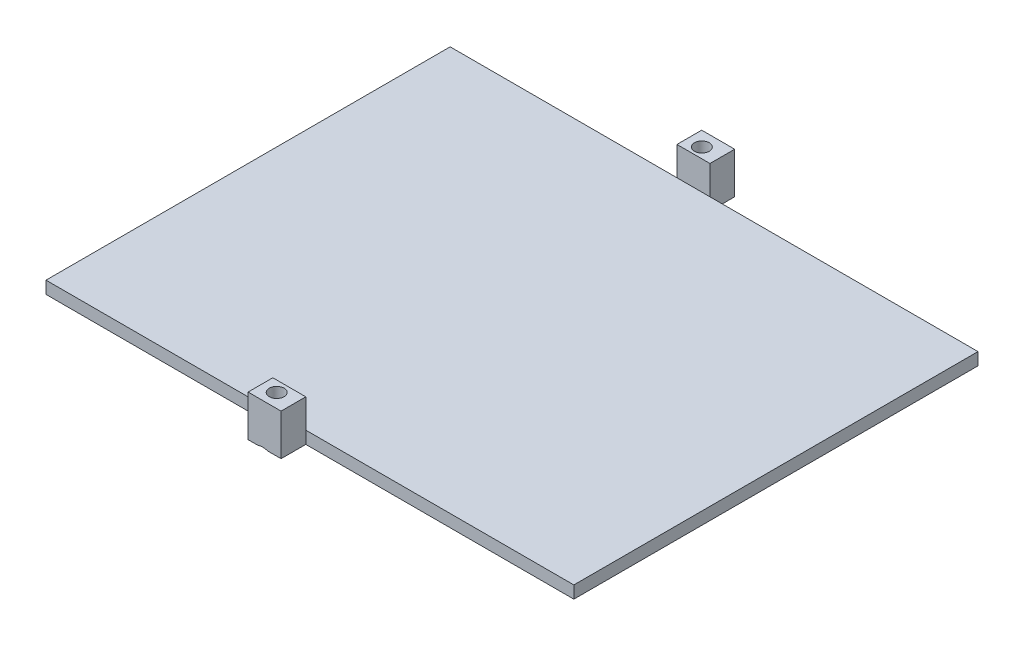
ISO-10303-21;
HEADER;
FILE_DESCRIPTION(('STEP AP214'),'2;1');
FILE_NAME('part.step','',(''),(''),'','','');
FILE_SCHEMA(('AUTOMOTIVE_DESIGN { 1 0 10303 214 1 1 1 1 }'));
ENDSEC;
DATA;
#1=APPLICATION_CONTEXT('core data for automotive mechanical design processes');
#2=APPLICATION_PROTOCOL_DEFINITION('international standard','automotive_design',2000,#1);
#3=PRODUCT_CONTEXT('',#1,'mechanical');
#4=PRODUCT('Part','Part','',(#3));
#5=PRODUCT_RELATED_PRODUCT_CATEGORY('part','',(#4));
#6=PRODUCT_DEFINITION_FORMATION('','',#4);
#7=PRODUCT_DEFINITION_CONTEXT('part definition',#1,'design');
#8=PRODUCT_DEFINITION('design','',#6,#7);
#9=PRODUCT_DEFINITION_SHAPE('','',#8);
#10=(LENGTH_UNIT() NAMED_UNIT(*) SI_UNIT(.MILLI.,.METRE.));
#11=(NAMED_UNIT(*) PLANE_ANGLE_UNIT() SI_UNIT($,.RADIAN.));
#12=(NAMED_UNIT(*) SI_UNIT($,.STERADIAN.) SOLID_ANGLE_UNIT());
#13=UNCERTAINTY_MEASURE_WITH_UNIT(LENGTH_MEASURE(1.E-05),#10,'distance_accuracy_value','');
#14=(GEOMETRIC_REPRESENTATION_CONTEXT(3) GLOBAL_UNCERTAINTY_ASSIGNED_CONTEXT((#13)) GLOBAL_UNIT_ASSIGNED_CONTEXT((#10,
#11,#12)) REPRESENTATION_CONTEXT('',''));
#15=CARTESIAN_POINT('',(0.,0.,0.));
#16=DIRECTION('',(0.,0.,1.));
#17=DIRECTION('',(1.,0.,0.));
#18=AXIS2_PLACEMENT_3D('',#15,#16,#17);
#19=CARTESIAN_POINT('',(0.,0.,0.));
#20=DIRECTION('',(0.,1.,0.));
#21=DIRECTION('',(0.,0.,1.));
#22=AXIS2_PLACEMENT_3D('',#19,#20,#21);
#23=PLANE('',#22);
#24=CARTESIAN_POINT('',(29.2790451550786,0.,-50.2373383304988));
#25=DIRECTION('',(0.,-1.,0.));
#26=DIRECTION('',(0.,0.,-1.));
#27=AXIS2_PLACEMENT_3D('',#24,#25,#26);
#28=CIRCLE('',#27,1.8);
#29=CARTESIAN_POINT('',(29.6437694877894,0.,-52.));
#30=VERTEX_POINT('',#29);
#31=CARTESIAN_POINT('',(27.5,0.,-49.9634800894483));
#32=VERTEX_POINT('',#31);
#33=EDGE_CURVE('E54',#30,#32,#28,.T.);
#34=ORIENTED_EDGE('',*,*,#33,.F.);
#35=DIRECTION('',(-1.,0.,0.));
#36=VECTOR('',#35,1.);
#37=CARTESIAN_POINT('',(31.5,0.,-52.));
#38=LINE('',#37,#36);
#39=CARTESIAN_POINT('',(31.5,0.,-52.));
#40=VERTEX_POINT('',#39);
#41=EDGE_CURVE('E174',#40,#30,#38,.T.);
#42=ORIENTED_EDGE('',*,*,#41,.F.);
#43=DIRECTION('',(0.,0.,-1.));
#44=VECTOR('',#43,1.);
#45=CARTESIAN_POINT('',(31.5,0.,-49.));
#46=LINE('',#45,#44);
#47=CARTESIAN_POINT('',(31.5,0.,-49.));
#48=VERTEX_POINT('',#47);
#49=EDGE_CURVE('E188',#48,#40,#46,.T.);
#50=ORIENTED_EDGE('',*,*,#49,.F.);
#51=DIRECTION('',(-1.,0.,0.));
#52=VECTOR('',#51,1.);
#53=CARTESIAN_POINT('',(64.,0.,-49.));
#54=LINE('',#53,#52);
#55=CARTESIAN_POINT('',(64.,0.,-49.));
#56=VERTEX_POINT('',#55);
#57=EDGE_CURVE('E245',#56,#48,#54,.T.);
#58=ORIENTED_EDGE('',*,*,#57,.F.);
#59=DIRECTION('',(0.,0.,-1.));
#60=VECTOR('',#59,1.);
#61=CARTESIAN_POINT('',(64.,0.,0.));
#62=LINE('',#61,#60);
#63=CARTESIAN_POINT('',(64.,0.,0.));
#64=VERTEX_POINT('',#63);
#65=EDGE_CURVE('E264',#64,#56,#62,.T.);
#66=ORIENTED_EDGE('',*,*,#65,.F.);
#67=DIRECTION('',(1.,0.,0.));
#68=VECTOR('',#67,1.);
#69=CARTESIAN_POINT('',(0.,0.,0.));
#70=LINE('',#69,#68);
#71=CARTESIAN_POINT('',(31.5,0.,0.));
#72=VERTEX_POINT('',#71);
#73=EDGE_CURVE('E260',#72,#64,#70,.T.);
#74=ORIENTED_EDGE('',*,*,#73,.F.);
#75=DIRECTION('',(0.,0.,-1.));
#76=VECTOR('',#75,1.);
#77=CARTESIAN_POINT('',(31.5,0.,3.));
#78=LINE('',#77,#76);
#79=CARTESIAN_POINT('',(31.5,0.,3.));
#80=VERTEX_POINT('',#79);
#81=EDGE_CURVE('E212',#80,#72,#78,.T.);
#82=ORIENTED_EDGE('',*,*,#81,.F.);
#83=DIRECTION('',(1.,0.,0.));
#84=VECTOR('',#83,1.);
#85=CARTESIAN_POINT('',(27.5,0.,3.));
#86=LINE('',#85,#84);
#87=CARTESIAN_POINT('',(29.8880433691836,0.,3.));
#88=VERTEX_POINT('',#87);
#89=EDGE_CURVE('E222',#88,#80,#86,.T.);
#90=ORIENTED_EDGE('',*,*,#89,.F.);
#91=CARTESIAN_POINT('',(29.2790451550786,0.,1.30615196218287));
#92=DIRECTION('',(0.,-1.,0.));
#93=DIRECTION('',(0.,0.,-1.));
#94=AXIS2_PLACEMENT_3D('',#91,#92,#93);
#95=CIRCLE('',#94,1.8);
#96=CARTESIAN_POINT('',(27.5,0.,1.03229372113234));
#97=VERTEX_POINT('',#96);
#98=EDGE_CURVE('E61',#97,#88,#95,.T.);
#99=ORIENTED_EDGE('',*,*,#98,.F.);
#100=DIRECTION('',(0.,0.,1.));
#101=VECTOR('',#100,1.);
#102=CARTESIAN_POINT('',(27.5,0.,0.));
#103=LINE('',#102,#101);
#104=CARTESIAN_POINT('',(27.5,0.,0.));
#105=VERTEX_POINT('',#104);
#106=EDGE_CURVE('E219',#105,#97,#103,.T.);
#107=ORIENTED_EDGE('',*,*,#106,.F.);
#108=CARTESIAN_POINT('',(0.,0.,0.));
#109=VERTEX_POINT('',#108);
#110=EDGE_CURVE('E261',#109,#105,#70,.T.);
#111=ORIENTED_EDGE('',*,*,#110,.F.);
#112=DIRECTION('',(0.,0.,1.));
#113=VECTOR('',#112,1.);
#114=CARTESIAN_POINT('',(0.,0.,-49.));
#115=LINE('',#114,#113);
#116=CARTESIAN_POINT('',(0.,0.,-49.));
#117=VERTEX_POINT('',#116);
#118=EDGE_CURVE('E239',#117,#109,#115,.T.);
#119=ORIENTED_EDGE('',*,*,#118,.F.);
#120=CARTESIAN_POINT('',(27.5,0.,-49.));
#121=VERTEX_POINT('',#120);
#122=EDGE_CURVE('E266',#121,#117,#54,.T.);
#123=ORIENTED_EDGE('',*,*,#122,.F.);
#124=DIRECTION('',(0.,0.,1.));
#125=VECTOR('',#124,1.);
#126=CARTESIAN_POINT('',(27.5,0.,-52.));
#127=LINE('',#126,#125);
#128=EDGE_CURVE('E176',#32,#121,#127,.T.);
#129=ORIENTED_EDGE('',*,*,#128,.F.);
#130=EDGE_LOOP('',(#34,#42,#50,#58,#66,#74,#82,#90,#99,#107,#111,#119,#123,#129));
#131=FACE_BOUND('',#130,.T.);
#132=ADVANCED_FACE('F33',(#131),#23,.F.);
#133=CARTESIAN_POINT('',(27.5,0.,-50.5111965715493));
#134=VERTEX_POINT('',#133);
#135=CARTESIAN_POINT('',(28.9143208223679,0.,-52.));
#136=VERTEX_POINT('',#135);
#137=EDGE_CURVE('E164',#134,#136,#28,.T.);
#138=ORIENTED_EDGE('',*,*,#137,.F.);
#139=CARTESIAN_POINT('',(27.5,0.,-52.));
#140=VERTEX_POINT('',#139);
#141=EDGE_CURVE('E186',#140,#134,#127,.T.);
#142=ORIENTED_EDGE('',*,*,#141,.F.);
#143=EDGE_CURVE('E184',#136,#140,#38,.T.);
#144=ORIENTED_EDGE('',*,*,#143,.F.);
#145=EDGE_LOOP('',(#138,#142,#144));
#146=FACE_BOUND('',#145,.T.);
#147=ADVANCED_FACE('F330',(#146),#23,.F.);
#148=CARTESIAN_POINT('',(28.6700469409736,0.,3.));
#149=VERTEX_POINT('',#148);
#150=CARTESIAN_POINT('',(27.5,0.,1.58001020323339));
#151=VERTEX_POINT('',#150);
#152=EDGE_CURVE('E606',#149,#151,#95,.T.);
#153=ORIENTED_EDGE('',*,*,#152,.F.);
#154=CARTESIAN_POINT('',(27.5,0.,3.));
#155=VERTEX_POINT('',#154);
#156=EDGE_CURVE('E223',#155,#149,#86,.T.);
#157=ORIENTED_EDGE('',*,*,#156,.F.);
#158=EDGE_CURVE('E206',#151,#155,#103,.T.);
#159=ORIENTED_EDGE('',*,*,#158,.F.);
#160=EDGE_LOOP('',(#153,#157,#159));
#161=FACE_BOUND('',#160,.T.);
#162=ADVANCED_FACE('F326',(#161),#23,.F.);
#163=CARTESIAN_POINT('',(64.,1.5,-49.));
#164=DIRECTION('',(0.,0.,1.));
#165=DIRECTION('',(1.,0.,0.));
#166=AXIS2_PLACEMENT_3D('',#163,#164,#165);
#167=PLANE('',#166);
#168=DIRECTION('',(0.,-1.,0.));
#169=VECTOR('',#168,1.);
#170=CARTESIAN_POINT('',(31.5,5.,-49.));
#171=LINE('',#170,#169);
#172=CARTESIAN_POINT('',(31.5,1.5,-49.));
#173=VERTEX_POINT('',#172);
#174=EDGE_CURVE('E207',#173,#48,#171,.T.);
#175=ORIENTED_EDGE('',*,*,#174,.F.);
#176=DIRECTION('',(-1.,0.,0.));
#177=VECTOR('',#176,1.);
#178=CARTESIAN_POINT('',(64.,1.5,-49.));
#179=LINE('',#178,#177);
#180=CARTESIAN_POINT('',(64.,1.5,-49.));
#181=VERTEX_POINT('',#180);
#182=EDGE_CURVE('E253',#181,#173,#179,.T.);
#183=ORIENTED_EDGE('',*,*,#182,.F.);
#184=DIRECTION('',(0.,-1.,0.));
#185=VECTOR('',#184,1.);
#186=CARTESIAN_POINT('',(64.,1.5,-49.));
#187=LINE('',#186,#185);
#188=EDGE_CURVE('E271',#181,#56,#187,.T.);
#189=ORIENTED_EDGE('',*,*,#188,.T.);
#190=ORIENTED_EDGE('',*,*,#57,.T.);
#191=EDGE_LOOP('',(#175,#183,#189,#190));
#192=FACE_BOUND('',#191,.T.);
#193=ADVANCED_FACE('F329',(#192),#167,.F.);
#194=CARTESIAN_POINT('',(0.,1.5,0.));
#195=DIRECTION('',(0.,0.,-1.));
#196=DIRECTION('',(-1.,0.,0.));
#197=AXIS2_PLACEMENT_3D('',#194,#195,#196);
#198=PLANE('',#197);
#199=DIRECTION('',(0.,-1.,0.));
#200=VECTOR('',#199,1.);
#201=CARTESIAN_POINT('',(27.5,5.,0.));
#202=LINE('',#201,#200);
#203=CARTESIAN_POINT('',(27.5,1.5,0.));
#204=VERTEX_POINT('',#203);
#205=EDGE_CURVE('E240',#204,#105,#202,.T.);
#206=ORIENTED_EDGE('',*,*,#205,.F.);
#207=DIRECTION('',(1.,0.,0.));
#208=VECTOR('',#207,1.);
#209=CARTESIAN_POINT('',(0.,1.5,0.));
#210=LINE('',#209,#208);
#211=CARTESIAN_POINT('',(0.,1.5,0.));
#212=VERTEX_POINT('',#211);
#213=EDGE_CURVE('E246',#212,#204,#210,.T.);
#214=ORIENTED_EDGE('',*,*,#213,.F.);
#215=DIRECTION('',(0.,-1.,0.));
#216=VECTOR('',#215,1.);
#217=CARTESIAN_POINT('',(0.,1.5,0.));
#218=LINE('',#217,#216);
#219=EDGE_CURVE('E277',#212,#109,#218,.T.);
#220=ORIENTED_EDGE('',*,*,#219,.T.);
#221=ORIENTED_EDGE('',*,*,#110,.T.);
#222=EDGE_LOOP('',(#206,#214,#220,#221));
#223=FACE_BOUND('',#222,.T.);
#224=ADVANCED_FACE('F341',(#223),#198,.F.);
#225=CARTESIAN_POINT('',(0.,1.5,-49.));
#226=DIRECTION('',(1.,0.,0.));
#227=DIRECTION('',(0.,0.,-1.));
#228=AXIS2_PLACEMENT_3D('',#225,#226,#227);
#229=PLANE('',#228);
#230=ORIENTED_EDGE('',*,*,#118,.T.);
#231=ORIENTED_EDGE('',*,*,#219,.F.);
#232=DIRECTION('',(0.,0.,1.));
#233=VECTOR('',#232,1.);
#234=CARTESIAN_POINT('',(0.,1.5,-49.));
#235=LINE('',#234,#233);
#236=CARTESIAN_POINT('',(0.,1.5,-49.));
#237=VERTEX_POINT('',#236);
#238=EDGE_CURVE('E241',#237,#212,#235,.T.);
#239=ORIENTED_EDGE('',*,*,#238,.F.);
#240=DIRECTION('',(0.,-1.,0.));
#241=VECTOR('',#240,1.);
#242=CARTESIAN_POINT('',(0.,1.5,-49.));
#243=LINE('',#242,#241);
#244=EDGE_CURVE('E256',#237,#117,#243,.T.);
#245=ORIENTED_EDGE('',*,*,#244,.T.);
#246=EDGE_LOOP('',(#230,#231,#239,#245));
#247=FACE_BOUND('',#246,.T.);
#248=ADVANCED_FACE('F35',(#247),#229,.F.);
#249=CARTESIAN_POINT('',(31.5,1.5,0.));
#250=VERTEX_POINT('',#249);
#251=CARTESIAN_POINT('',(64.,1.5,0.));
#252=VERTEX_POINT('',#251);
#253=EDGE_CURVE('E244',#250,#252,#210,.T.);
#254=ORIENTED_EDGE('',*,*,#253,.F.);
#255=DIRECTION('',(0.,-1.,0.));
#256=VECTOR('',#255,1.);
#257=CARTESIAN_POINT('',(31.5,5.,0.));
#258=LINE('',#257,#256);
#259=EDGE_CURVE('E230',#250,#72,#258,.T.);
#260=ORIENTED_EDGE('',*,*,#259,.T.);
#261=ORIENTED_EDGE('',*,*,#73,.T.);
#262=DIRECTION('',(0.,-1.,0.));
#263=VECTOR('',#262,1.);
#264=CARTESIAN_POINT('',(64.,1.5,0.));
#265=LINE('',#264,#263);
#266=EDGE_CURVE('E274',#252,#64,#265,.T.);
#267=ORIENTED_EDGE('',*,*,#266,.F.);
#268=EDGE_LOOP('',(#254,#260,#261,#267));
#269=FACE_BOUND('',#268,.T.);
#270=ADVANCED_FACE('F337',(#269),#198,.F.);
#271=CARTESIAN_POINT('',(64.,1.5,0.));
#272=DIRECTION('',(-1.,0.,0.));
#273=DIRECTION('',(0.,0.,1.));
#274=AXIS2_PLACEMENT_3D('',#271,#272,#273);
#275=PLANE('',#274);
#276=ORIENTED_EDGE('',*,*,#65,.T.);
#277=ORIENTED_EDGE('',*,*,#188,.F.);
#278=DIRECTION('',(0.,0.,-1.));
#279=VECTOR('',#278,1.);
#280=CARTESIAN_POINT('',(64.,1.5,0.));
#281=LINE('',#280,#279);
#282=EDGE_CURVE('E249',#252,#181,#281,.T.);
#283=ORIENTED_EDGE('',*,*,#282,.F.);
#284=ORIENTED_EDGE('',*,*,#266,.T.);
#285=EDGE_LOOP('',(#276,#277,#283,#284));
#286=FACE_BOUND('',#285,.T.);
#287=ADVANCED_FACE('F334',(#286),#275,.F.);
#288=CARTESIAN_POINT('',(27.5,1.5,-49.));
#289=VERTEX_POINT('',#288);
#290=EDGE_CURVE('E252',#289,#237,#179,.T.);
#291=ORIENTED_EDGE('',*,*,#290,.F.);
#292=DIRECTION('',(0.,-1.,0.));
#293=VECTOR('',#292,1.);
#294=CARTESIAN_POINT('',(27.5,5.,-49.));
#295=LINE('',#294,#293);
#296=EDGE_CURVE('E199',#289,#121,#295,.T.);
#297=ORIENTED_EDGE('',*,*,#296,.T.);
#298=ORIENTED_EDGE('',*,*,#122,.T.);
#299=ORIENTED_EDGE('',*,*,#244,.F.);
#300=EDGE_LOOP('',(#291,#297,#298,#299));
#301=FACE_BOUND('',#300,.T.);
#302=ADVANCED_FACE('F324',(#301),#167,.F.);
#303=CARTESIAN_POINT('',(0.,1.5,0.));
#304=DIRECTION('',(0.,1.,0.));
#305=DIRECTION('',(0.,0.,1.));
#306=AXIS2_PLACEMENT_3D('',#303,#304,#305);
#307=PLANE('',#306);
#308=ORIENTED_EDGE('',*,*,#238,.T.);
#309=ORIENTED_EDGE('',*,*,#213,.T.);
#310=EDGE_CURVE('E250',#204,#250,#210,.T.);
#311=ORIENTED_EDGE('',*,*,#310,.T.);
#312=ORIENTED_EDGE('',*,*,#253,.T.);
#313=ORIENTED_EDGE('',*,*,#282,.T.);
#314=ORIENTED_EDGE('',*,*,#182,.T.);
#315=EDGE_CURVE('E257',#173,#289,#179,.T.);
#316=ORIENTED_EDGE('',*,*,#315,.T.);
#317=ORIENTED_EDGE('',*,*,#290,.T.);
#318=EDGE_LOOP('',(#308,#309,#311,#312,#313,#314,#316,#317));
#319=FACE_BOUND('',#318,.T.);
#320=ADVANCED_FACE('F320',(#319),#307,.T.);
#321=CARTESIAN_POINT('',(31.5,5.,0.));
#322=DIRECTION('',(0.,0.,1.));
#323=DIRECTION('',(1.,0.,0.));
#324=AXIS2_PLACEMENT_3D('',#321,#322,#323);
#325=PLANE('',#324);
#326=ORIENTED_EDGE('',*,*,#310,.F.);
#327=CARTESIAN_POINT('',(27.5,5.,0.));
#328=VERTEX_POINT('',#327);
#329=EDGE_CURVE('E236',#328,#204,#202,.T.);
#330=ORIENTED_EDGE('',*,*,#329,.F.);
#331=DIRECTION('',(-1.,0.,0.));
#332=VECTOR('',#331,1.);
#333=CARTESIAN_POINT('',(31.5,5.,0.));
#334=LINE('',#333,#332);
#335=CARTESIAN_POINT('',(31.5,5.,0.));
#336=VERTEX_POINT('',#335);
#337=EDGE_CURVE('E208',#336,#328,#334,.T.);
#338=ORIENTED_EDGE('',*,*,#337,.F.);
#339=EDGE_CURVE('E218',#336,#250,#258,.T.);
#340=ORIENTED_EDGE('',*,*,#339,.T.);
#341=EDGE_LOOP('',(#326,#330,#338,#340));
#342=FACE_BOUND('',#341,.T.);
#343=ADVANCED_FACE('F316',(#342),#325,.F.);
#344=CARTESIAN_POINT('',(27.5,5.,0.));
#345=DIRECTION('',(1.,0.,0.));
#346=DIRECTION('',(0.,0.,-1.));
#347=AXIS2_PLACEMENT_3D('',#344,#345,#346);
#348=PLANE('',#347);
#349=ORIENTED_EDGE('',*,*,#106,.T.);
#350=CARTESIAN_POINT('',(27.5,-1.28646210378258,-1.21599923357786));
#351=CARTESIAN_POINT('',(27.5,-1.24591780699925,-1.16637998844583));
#352=CARTESIAN_POINT('',(27.5,-1.2056082634266,-1.11656923430908));
#353=CARTESIAN_POINT('',(27.5,-1.12554350691606,-1.01649876231024));
#354=CARTESIAN_POINT('',(27.5,-1.08578833273172,-0.966239013459812));
#355=CARTESIAN_POINT('',(27.5,-0.967313590473821,-0.814471697888863));
#356=CARTESIAN_POINT('',(27.5,-0.889567029054811,-0.712197543706154));
#357=CARTESIAN_POINT('',(27.5,-0.734922457400807,-0.501108451613216));
#358=CARTESIAN_POINT('',(27.5,-0.658162797913361,-0.392191599404675));
#359=CARTESIAN_POINT('',(27.5,-0.510544575168355,-0.170494757893909));
#360=CARTESIAN_POINT('',(27.5,-0.43968045021399,-0.0577185545034803));
#361=CARTESIAN_POINT('',(27.5,-0.33546718766624,0.123733770127529));
#362=CARTESIAN_POINT('',(27.5,-0.299039837635447,0.190632663948957));
#363=CARTESIAN_POINT('',(27.5,-0.230110309003145,0.32646857701114));
#364=CARTESIAN_POINT('',(27.5,-0.197609138364612,0.395406113999539));
#365=CARTESIAN_POINT('',(27.5,-0.13805876171254,0.534793264217515));
#366=CARTESIAN_POINT('',(27.5,-0.110956913517264,0.605220029317504));
#367=CARTESIAN_POINT('',(27.5,-0.0632662900557561,0.74821370886901));
#368=CARTESIAN_POINT('',(27.5,-0.0426716548638833,0.820778633086543));
#369=CARTESIAN_POINT('',(27.5,-0.00737419868512489,0.977333119513537));
#370=CARTESIAN_POINT('',(27.5,0.00621727524654136,1.06158327995912));
#371=CARTESIAN_POINT('',(27.5,0.0216700822665541,1.23450702010144));
#372=CARTESIAN_POINT('',(27.5,0.0230546718075783,1.32322520356131));
#373=CARTESIAN_POINT('',(27.5,0.0126188700287873,1.49983082970193));
#374=CARTESIAN_POINT('',(27.5,0.000801534021502215,1.5877184598509));
#375=CARTESIAN_POINT('',(27.5,-0.0309477936322097,1.74445036004159));
#376=CARTESIAN_POINT('',(27.5,-0.0488921570656831,1.81371804555592));
#377=CARTESIAN_POINT('',(27.5,-0.0909758966537656,1.95036988913008));
#378=CARTESIAN_POINT('',(27.5,-0.115119629653604,2.01775268542757));
#379=CARTESIAN_POINT('',(27.5,-0.168653914384134,2.15137204851767));
#380=CARTESIAN_POINT('',(27.5,-0.198107802772403,2.21758282095263));
#381=CARTESIAN_POINT('',(27.5,-0.260909047474967,2.34808004026));
#382=CARTESIAN_POINT('',(27.5,-0.294254990586543,2.41236717501744));
#383=CARTESIAN_POINT('',(27.5,-0.363688366746565,2.53875592662097));
#384=CARTESIAN_POINT('',(27.5,-0.399751552505198,2.60087097702171));
#385=CARTESIAN_POINT('',(27.5,-0.474212201900913,2.72369123493805));
#386=CARTESIAN_POINT('',(27.5,-0.512610079152108,2.78439618999293));
#387=CARTESIAN_POINT('',(27.5,-0.630598965397542,2.96480907871446));
#388=CARTESIAN_POINT('',(27.5,-0.712931154049464,3.08272026471692));
#389=CARTESIAN_POINT('',(27.5,-0.882598938612192,3.31554800738137));
#390=CARTESIAN_POINT('',(27.5,-0.969953182674389,3.4304507425762));
#391=CARTESIAN_POINT('',(27.5,-1.14788261067765,3.65774856858052));
#392=CARTESIAN_POINT('',(27.5,-1.23845821523847,3.77014332877733));
#393=CARTESIAN_POINT('',(27.5,-1.41305916488134,3.98234568251251));
#394=CARTESIAN_POINT('',(27.5,-1.49687728330769,4.08232472933764));
#395=CARTESIAN_POINT('',(27.5,-1.66592173316761,4.2811046399282));
#396=CARTESIAN_POINT('',(27.5,-1.75114823882716,4.3799053552844));
#397=CARTESIAN_POINT('',(27.5,-1.92189230856886,4.57567155956786));
#398=CARTESIAN_POINT('',(27.5,-2.00740012784634,4.67264556810013));
#399=CARTESIAN_POINT('',(27.5,-2.17924184577358,4.86582515994719));
#400=CARTESIAN_POINT('',(27.5,-2.26557557821085,4.9620308910111));
#401=CARTESIAN_POINT('',(27.5,-2.35222532623173,5.05794799821566));
#402=B_SPLINE_CURVE_WITH_KNOTS('',3,(#350,#351,#352,#353,#354,#355,#356,#357,#358,#359,#360,
#361,#362,#363,#364,#365,#366,#367,#368,#369,#370,#371,#372,#373,#374,#375,#376,#377,#378,#379,
#380,#381,#382,#383,#384,#385,#386,#387,#388,#389,#390,#391,#392,#393,#394,#395,#396,#397,#398,
#399,#400,#401),.UNSPECIFIED.,.F.,.F.,(4,2,2,2,2,2,2,2,2,2,2,2,2,2,2,2,2,2,2,2,2,2,2,2,2,4),(0.,
0.192230272386799,0.384473916065649,0.769821433054558,1.16945709238644,1.56871136657412,
1.79713609466436,2.0256193418698,2.25175231697135,2.47768106881309,2.73292753842559,
2.99810058692516,3.26321227931959,3.47754872048157,3.69203620908366,3.90927530548018,
4.12643576645264,4.34184693349874,4.55729637462845,4.98852195671352,5.4214676618884,
5.85447010673952,6.24585217086758,6.63728301923279,7.02514366018274,7.41292782203391),.UNSPECIFIED.);
#403=EDGE_CURVE('E301',#97,#151,#402,.T.);
#404=ORIENTED_EDGE('',*,*,#403,.T.);
#405=ORIENTED_EDGE('',*,*,#158,.T.);
#406=DIRECTION('',(0.,-1.,0.));
#407=VECTOR('',#406,1.);
#408=CARTESIAN_POINT('',(27.5,5.,3.));
#409=LINE('',#408,#407);
#410=CARTESIAN_POINT('',(27.5,5.,3.));
#411=VERTEX_POINT('',#410);
#412=EDGE_CURVE('E233',#411,#155,#409,.T.);
#413=ORIENTED_EDGE('',*,*,#412,.F.);
#414=DIRECTION('',(0.,0.,1.));
#415=VECTOR('',#414,1.);
#416=CARTESIAN_POINT('',(27.5,5.,0.));
#417=LINE('',#416,#415);
#418=EDGE_CURVE('E211',#328,#411,#417,.T.);
#419=ORIENTED_EDGE('',*,*,#418,.F.);
#420=ORIENTED_EDGE('',*,*,#329,.T.);
#421=ORIENTED_EDGE('',*,*,#205,.T.);
#422=EDGE_LOOP('',(#349,#404,#405,#413,#419,#420,#421));
#423=FACE_BOUND('',#422,.T.);
#424=ADVANCED_FACE('F312',(#423),#348,.F.);
#425=CARTESIAN_POINT('',(27.5,5.,3.));
#426=DIRECTION('',(0.,0.,-1.));
#427=DIRECTION('',(-1.,0.,0.));
#428=AXIS2_PLACEMENT_3D('',#425,#426,#427);
#429=PLANE('',#428);
#430=ORIENTED_EDGE('',*,*,#156,.T.);
#431=CARTESIAN_POINT('',(25.4728476639373,-2.36608455468529,3.));
#432=CARTESIAN_POINT('',(25.5547570079711,-2.29125882936948,3.));
#433=CARTESIAN_POINT('',(25.6368583330056,-2.21664187663049,3.));
#434=CARTESIAN_POINT('',(25.8015406308644,-2.06793100744865,3.));
#435=CARTESIAN_POINT('',(25.8841216276794,-1.99383711758457,3.));
#436=CARTESIAN_POINT('',(26.0500453386004,-1.84611215466253,3.));
#437=CARTESIAN_POINT('',(26.1333893862318,-1.77248257741655,3.));
#438=CARTESIAN_POINT('',(26.3007703544818,-1.62601799913877,3.));
#439=CARTESIAN_POINT('',(26.384807260098,-1.55318298098117,3.));
#440=CARTESIAN_POINT('',(26.5614749335698,-1.40188059098184,3.));
#441=CARTESIAN_POINT('',(26.6541876015589,-1.32350862725678,3.));
#442=CARTESIAN_POINT('',(26.8409069904305,-1.16832281676904,3.));
#443=CARTESIAN_POINT('',(26.9349136715661,-1.09150892232727,3.));
#444=CARTESIAN_POINT('',(27.124503151189,-0.9400581646692,3.));
#445=CARTESIAN_POINT('',(27.2200841105542,-0.865419009077352,3.));
#446=CARTESIAN_POINT('',(27.4134387473418,-0.719049563921153,3.));
#447=CARTESIAN_POINT('',(27.5112120707922,-0.647318809953228,3.));
#448=CARTESIAN_POINT('',(27.7092393732495,-0.508342859333837,3.));
#449=CARTESIAN_POINT('',(27.8094795516465,-0.441078185597874,3.));
#450=CARTESIAN_POINT('',(28.0140260065071,-0.312591349069478,3.));
#451=CARTESIAN_POINT('',(28.1183377708415,-0.251377764142095,3.));
#452=CARTESIAN_POINT('',(28.3296784665316,-0.139724102397387,3.));
#453=CARTESIAN_POINT('',(28.4365924349755,-0.0890715119378915,3.));
#454=CARTESIAN_POINT('',(28.6559587121988,-0.0020379432276611,3.));
#455=CARTESIAN_POINT('',(28.7683898726369,0.0343933697053715,3.));
#456=CARTESIAN_POINT('',(28.9672089015429,0.0796254959454816,3.));
#457=CARTESIAN_POINT('',(29.0524772530118,0.0932202609482731,3.));
#458=CARTESIAN_POINT('',(29.2240949039288,0.107406694082881,3.));
#459=CARTESIAN_POINT('',(29.3104431804746,0.108009853818276,3.));
#460=CARTESIAN_POINT('',(29.445587880301,0.0987048025083706,3.));
#461=CARTESIAN_POINT('',(29.4947324995004,0.0931590703383703,3.));
#462=CARTESIAN_POINT('',(29.5924066544786,0.0780835192703453,3.));
#463=CARTESIAN_POINT('',(29.6409362143443,0.0685538568901607,3.));
#464=CARTESIAN_POINT('',(29.7373014242664,0.0458864631794164,3.));
#465=CARTESIAN_POINT('',(29.7851342617598,0.0327369493709911,3.));
#466=CARTESIAN_POINT('',(29.8798203535863,0.003327965630002,3.));
#467=CARTESIAN_POINT('',(29.9266736414336,-0.0129313977091041,3.));
#468=CARTESIAN_POINT('',(30.0953550296554,-0.0768658330617101,3.));
#469=CARTESIAN_POINT('',(30.2142177078786,-0.132357232449066,3.));
#470=CARTESIAN_POINT('',(30.44605963609,-0.254580802757419,3.));
#471=CARTESIAN_POINT('',(30.5590241046006,-0.321339592108075,3.));
#472=CARTESIAN_POINT('',(30.7258894048863,-0.427247171020847,3.));
#473=CARTESIAN_POINT('',(30.7814687998909,-0.463793788194709,3.));
#474=CARTESIAN_POINT('',(30.8916349736672,-0.538357184675139,3.));
#475=CARTESIAN_POINT('',(30.9462217219102,-0.576374009085664,3.));
#476=CARTESIAN_POINT('',(31.0544852537337,-0.653542573939427,3.));
#477=CARTESIAN_POINT('',(31.1081630463384,-0.692692904548965,3.));
#478=CARTESIAN_POINT('',(31.214795101276,-0.771960541878803,3.));
#479=CARTESIAN_POINT('',(31.2677493901527,-0.812077812974281,3.));
#480=CARTESIAN_POINT('',(31.4432665284492,-0.947140785315929,3.));
#481=CARTESIAN_POINT('',(31.5644714356228,-1.0438507832865,3.));
#482=CARTESIAN_POINT('',(31.8045368058855,-1.24014582140215,3.));
#483=CARTESIAN_POINT('',(31.9233969315265,-1.33973127035819,3.));
#484=CARTESIAN_POINT('',(32.1594423724302,-1.54095821031951,3.));
#485=CARTESIAN_POINT('',(32.276626996677,-1.64260051012363,3.));
#486=CARTESIAN_POINT('',(32.5097056969285,-1.84735632247487,3.));
#487=CARTESIAN_POINT('',(32.6255997361844,-1.95046987672561,3.));
#488=CARTESIAN_POINT('',(32.972276272416,-2.26185205257068,3.));
#489=CARTESIAN_POINT('',(33.2015861241479,-2.47175831535888,3.));
#490=CARTESIAN_POINT('',(33.657732670938,-2.89411470360604,3.));
#491=CARTESIAN_POINT('',(33.8845699583242,-3.10656419302956,3.));
#492=CARTESIAN_POINT('',(34.3102798010405,-3.50830426240943,3.));
#493=CARTESIAN_POINT('',(34.5093295228375,-3.69740728678254,3.));
#494=CARTESIAN_POINT('',(34.9065308779305,-4.07658304380564,3.));
#495=CARTESIAN_POINT('',(35.104682442226,-4.2666558486518,3.));
#496=CARTESIAN_POINT('',(35.4996233149123,-4.64684850989104,3.));
#497=CARTESIAN_POINT('',(35.6964149645629,-4.83696593598677,3.));
#498=CARTESIAN_POINT('',(36.0894553658511,-5.21772735785702,3.));
#499=CARTESIAN_POINT('',(36.2857041629279,-5.40837130671447,3.));
#500=CARTESIAN_POINT('',(36.4817642204398,-5.59920827587215,3.));
#501=B_SPLINE_CURVE_WITH_KNOTS('',3,(#431,#432,#433,#434,#435,#436,#437,#438,#439,#440,#441,
#442,#443,#444,#445,#446,#447,#448,#449,#450,#451,#452,#453,#454,#455,#456,#457,#458,#459,#460,
#461,#462,#463,#464,#465,#466,#467,#468,#469,#470,#471,#472,#473,#474,#475,#476,#477,#478,#479,
#480,#481,#482,#483,#484,#485,#486,#487,#488,#489,#490,#491,#492,#493,#494,#495,#496,#497,#498,
#499,#500),.UNSPECIFIED.,.F.,.F.,(4,2,2,2,2,2,2,2,2,2,2,2,2,2,2,2,2,2,2,2,2,2,2,2,2,2,2,2,2,2,2,
2,2,2,4),(0.,0.332825705890681,0.665668203887172,0.999292475015024,1.33290954099866,
1.69709480268782,2.06126890293439,2.42504411866548,2.78876101741082,3.1507704031213,
3.51328581824751,3.86759489730291,4.2206383137906,4.47882045728177,4.73677421877222,
4.8849920599271,5.03320407855113,5.18190434517827,5.33059951585595,5.72297990617565,
6.11630058674624,6.31583522264247,6.51537598485356,6.7146784065404,6.91397349655255,
7.37907439218062,7.84424174130322,8.3095957024323,8.77496288061515,9.70754926962399,
10.6399071082128,11.4635691765773,12.2872934849234,13.1081725340164,13.9289806558917),.UNSPECIFIED.);
#502=EDGE_CURVE('E47',#149,#88,#501,.T.);
#503=ORIENTED_EDGE('',*,*,#502,.T.);
#504=ORIENTED_EDGE('',*,*,#89,.T.);
#505=DIRECTION('',(0.,-1.,0.));
#506=VECTOR('',#505,1.);
#507=CARTESIAN_POINT('',(31.5,5.,3.));
#508=LINE('',#507,#506);
#509=CARTESIAN_POINT('',(31.5,5.,3.));
#510=VERTEX_POINT('',#509);
#511=EDGE_CURVE('E229',#510,#80,#508,.T.);
#512=ORIENTED_EDGE('',*,*,#511,.F.);
#513=DIRECTION('',(1.,0.,0.));
#514=VECTOR('',#513,1.);
#515=CARTESIAN_POINT('',(27.5,5.,3.));
#516=LINE('',#515,#514);
#517=EDGE_CURVE('E214',#411,#510,#516,.T.);
#518=ORIENTED_EDGE('',*,*,#517,.F.);
#519=ORIENTED_EDGE('',*,*,#412,.T.);
#520=EDGE_LOOP('',(#430,#503,#504,#512,#518,#519));
#521=FACE_BOUND('',#520,.T.);
#522=ADVANCED_FACE('F285',(#521),#429,.F.);
#523=CARTESIAN_POINT('',(31.5,5.,3.));
#524=DIRECTION('',(-1.,0.,0.));
#525=DIRECTION('',(0.,0.,1.));
#526=AXIS2_PLACEMENT_3D('',#523,#524,#525);
#527=PLANE('',#526);
#528=ORIENTED_EDGE('',*,*,#81,.T.);
#529=ORIENTED_EDGE('',*,*,#259,.F.);
#530=ORIENTED_EDGE('',*,*,#339,.F.);
#531=DIRECTION('',(0.,0.,-1.));
#532=VECTOR('',#531,1.);
#533=CARTESIAN_POINT('',(31.5,5.,3.));
#534=LINE('',#533,#532);
#535=EDGE_CURVE('E216',#510,#336,#534,.T.);
#536=ORIENTED_EDGE('',*,*,#535,.F.);
#537=ORIENTED_EDGE('',*,*,#511,.T.);
#538=EDGE_LOOP('',(#528,#529,#530,#536,#537));
#539=FACE_BOUND('',#538,.T.);
#540=ADVANCED_FACE('F405',(#539),#527,.F.);
#541=CARTESIAN_POINT('',(0.,5.,0.));
#542=DIRECTION('',(0.,1.,0.));
#543=DIRECTION('',(0.,0.,1.));
#544=AXIS2_PLACEMENT_3D('',#541,#542,#543);
#545=PLANE('',#544);
#546=CARTESIAN_POINT('',(29.2790451550786,5.,1.30615196218287));
#547=DIRECTION('',(0.,-1.,0.));
#548=DIRECTION('',(0.,0.,-1.));
#549=AXIS2_PLACEMENT_3D('',#546,#547,#548);
#550=CIRCLE('',#549,0.899999999999998);
#551=CARTESIAN_POINT('',(29.2790451550786,5.,0.406151962182869));
#552=VERTEX_POINT('',#551);
#553=EDGE_CURVE('E309',#552,#552,#550,.T.);
#554=ORIENTED_EDGE('',*,*,#553,.T.);
#555=EDGE_LOOP('',(#554));
#556=FACE_BOUND('',#555,.T.);
#557=ORIENTED_EDGE('',*,*,#337,.T.);
#558=ORIENTED_EDGE('',*,*,#418,.T.);
#559=ORIENTED_EDGE('',*,*,#517,.T.);
#560=ORIENTED_EDGE('',*,*,#535,.T.);
#561=EDGE_LOOP('',(#557,#558,#559,#560));
#562=FACE_BOUND('',#561,.T.);
#563=ADVANCED_FACE('F402',(#556,#562),#545,.T.);
#564=CARTESIAN_POINT('',(27.5,5.,-49.));
#565=DIRECTION('',(0.,0.,-1.));
#566=DIRECTION('',(-1.,0.,0.));
#567=AXIS2_PLACEMENT_3D('',#564,#565,#566);
#568=PLANE('',#567);
#569=ORIENTED_EDGE('',*,*,#315,.F.);
#570=CARTESIAN_POINT('',(31.5,5.,-49.));
#571=VERTEX_POINT('',#570);
#572=EDGE_CURVE('E203',#571,#173,#171,.T.);
#573=ORIENTED_EDGE('',*,*,#572,.F.);
#574=DIRECTION('',(1.,0.,0.));
#575=VECTOR('',#574,1.);
#576=CARTESIAN_POINT('',(27.5,5.,-49.));
#577=LINE('',#576,#575);
#578=CARTESIAN_POINT('',(27.5,5.,-49.));
#579=VERTEX_POINT('',#578);
#580=EDGE_CURVE('E193',#579,#571,#577,.T.);
#581=ORIENTED_EDGE('',*,*,#580,.F.);
#582=EDGE_CURVE('E194',#579,#289,#295,.T.);
#583=ORIENTED_EDGE('',*,*,#582,.T.);
#584=EDGE_LOOP('',(#569,#573,#581,#583));
#585=FACE_BOUND('',#584,.T.);
#586=ADVANCED_FACE('F370',(#585),#568,.F.);
#587=CARTESIAN_POINT('',(31.5,5.,-49.));
#588=DIRECTION('',(-1.,0.,0.));
#589=DIRECTION('',(0.,0.,1.));
#590=AXIS2_PLACEMENT_3D('',#587,#588,#589);
#591=PLANE('',#590);
#592=ORIENTED_EDGE('',*,*,#49,.T.);
#593=DIRECTION('',(0.,-1.,0.));
#594=VECTOR('',#593,1.);
#595=CARTESIAN_POINT('',(31.5,5.,-52.));
#596=LINE('',#595,#594);
#597=CARTESIAN_POINT('',(31.5,5.,-52.));
#598=VERTEX_POINT('',#597);
#599=EDGE_CURVE('E183',#598,#40,#596,.T.);
#600=ORIENTED_EDGE('',*,*,#599,.F.);
#601=DIRECTION('',(0.,0.,-1.));
#602=VECTOR('',#601,1.);
#603=CARTESIAN_POINT('',(31.5,5.,-49.));
#604=LINE('',#603,#602);
#605=EDGE_CURVE('E364',#571,#598,#604,.T.);
#606=ORIENTED_EDGE('',*,*,#605,.F.);
#607=ORIENTED_EDGE('',*,*,#572,.T.);
#608=ORIENTED_EDGE('',*,*,#174,.T.);
#609=EDGE_LOOP('',(#592,#600,#606,#607,#608));
#610=FACE_BOUND('',#609,.T.);
#611=ADVANCED_FACE('F374',(#610),#591,.F.);
#612=CARTESIAN_POINT('',(31.5,5.,-52.));
#613=DIRECTION('',(0.,0.,1.));
#614=DIRECTION('',(1.,0.,0.));
#615=AXIS2_PLACEMENT_3D('',#612,#613,#614);
#616=PLANE('',#615);
#617=ORIENTED_EDGE('',*,*,#41,.T.);
#618=CARTESIAN_POINT('',(25.5418895295485,-2.33198600319027,-52.));
#619=CARTESIAN_POINT('',(25.6207946872586,-2.26062816072905,-52.));
#620=CARTESIAN_POINT('',(25.6998979541639,-2.18948789491355,-52.));
#621=CARTESIAN_POINT('',(25.8585938973964,-2.04774906868682,-52.));
#622=CARTESIAN_POINT('',(25.9381865935058,-1.97715053043429,-52.));
#623=CARTESIAN_POINT('',(26.0981303438438,-1.83644728556726,-52.));
#624=CARTESIAN_POINT('',(26.1784827135515,-1.76634407225406,-52.));
#625=CARTESIAN_POINT('',(26.3398867348801,-1.62694790877027,-52.));
#626=CARTESIAN_POINT('',(26.4209383800482,-1.55765495113667,-52.));
#627=CARTESIAN_POINT('',(26.5912227988596,-1.41389118257872,-52.));
#628=CARTESIAN_POINT('',(26.6805357823529,-1.3395151520686,-52.));
#629=CARTESIAN_POINT('',(26.8604344595902,-1.19231968122962,-52.));
#630=CARTESIAN_POINT('',(26.9510201139229,-1.11950019287406,-52.));
#631=CARTESIAN_POINT('',(27.133720646663,-0.976003370862639,-52.));
#632=CARTESIAN_POINT('',(27.2258337583388,-0.905323797677906,-52.));
#633=CARTESIAN_POINT('',(27.4121613777313,-0.766777378664075,-52.));
#634=CARTESIAN_POINT('',(27.506375846895,-0.698910481296715,-52.));
#635=CARTESIAN_POINT('',(27.7025218156299,-0.563700071127596,-52.));
#636=CARTESIAN_POINT('',(27.8045999136146,-0.496567035648925,-52.));
#637=CARTESIAN_POINT('',(28.0129396281952,-0.368690304025297,-52.));
#638=CARTESIAN_POINT('',(28.1192065379411,-0.307955072866726,-52.));
#639=CARTESIAN_POINT('',(28.3343872732978,-0.197749021030215,-52.));
#640=CARTESIAN_POINT('',(28.4431790846546,-0.148045792539337,-52.));
#641=CARTESIAN_POINT('',(28.6662830616308,-0.0633092965833715,-52.));
#642=CARTESIAN_POINT('',(28.7805784247374,-0.0282341883095592,-52.));
#643=CARTESIAN_POINT('',(28.9845355819533,0.0149406904506369,-52.));
#644=CARTESIAN_POINT('',(29.0732047120287,0.0275943022939528,-52.));
#645=CARTESIAN_POINT('',(29.2513769973406,0.0393573155215296,-52.));
#646=CARTESIAN_POINT('',(29.3408791340172,0.0384815193099494,-52.));
#647=CARTESIAN_POINT('',(29.5311711631083,0.0222639823176092,-52.));
#648=CARTESIAN_POINT('',(29.6317891795706,0.00491632480208499,-52.));
#649=CARTESIAN_POINT('',(29.7803606891844,-0.0319189172708065,-52.));
#650=CARTESIAN_POINT('',(29.8297424873559,-0.0461020998401859,-52.));
#651=CARTESIAN_POINT('',(29.9274950361166,-0.0775867535427481,-52.));
#652=CARTESIAN_POINT('',(29.9758660182633,-0.0948875015688183,-52.));
#653=CARTESIAN_POINT('',(30.0919039751442,-0.140041600833852,-52.));
#654=CARTESIAN_POINT('',(30.1590379864953,-0.169255478941296,-52.));
#655=CARTESIAN_POINT('',(30.2913591879076,-0.231835611191544,-52.));
#656=CARTESIAN_POINT('',(30.3565452125972,-0.265204291605208,-52.));
#657=CARTESIAN_POINT('',(30.4853985749855,-0.335258934736889,-52.));
#658=CARTESIAN_POINT('',(30.5490596235363,-0.371956371695142,-52.));
#659=CARTESIAN_POINT('',(30.6748793114801,-0.44784605993388,-52.));
#660=CARTESIAN_POINT('',(30.7370377234534,-0.487038685632677,-52.));
#661=CARTESIAN_POINT('',(30.8570978107345,-0.565430553487393,-52.));
#662=CARTESIAN_POINT('',(30.9150599246672,-0.604537712665321,-52.));
#663=CARTESIAN_POINT('',(31.0300036882159,-0.684173037369717,-52.));
#664=CARTESIAN_POINT('',(31.0869852556611,-0.724701321131632,-52.));
#665=CARTESIAN_POINT('',(31.1996007830679,-0.806534882429852,-52.));
#666=CARTESIAN_POINT('',(31.255242264328,-0.847829845004545,-52.));
#667=CARTESIAN_POINT('',(31.3658043275854,-0.931344662294071,-52.));
#668=CARTESIAN_POINT('',(31.4207250970437,-0.973564268560502,-52.));
#669=CARTESIAN_POINT('',(31.4753507993208,-1.0161560049221,-52.));
#670=B_SPLINE_CURVE_WITH_KNOTS('',3,(#618,#619,#620,#621,#622,#623,#624,#625,#626,#627,#628,
#629,#630,#631,#632,#633,#634,#635,#636,#637,#638,#639,#640,#641,#642,#643,#644,#645,#646,#647,
#648,#649,#650,#651,#652,#653,#654,#655,#656,#657,#658,#659,#660,#661,#662,#663,#664,#665,#666,
#667,#668,#669),.UNSPECIFIED.,.F.,.F.,(4,2,2,2,2,2,2,2,2,2,2,2,2,2,2,2,2,2,2,2,2,2,2,2,2,4),(0.,
0.319158857759672,0.638330701477153,0.958230400086715,1.27812714987328,1.62679329258413,
1.97544866172124,2.32372556125583,2.67199607629033,3.03836513540294,3.40521300761983,
3.76338601675598,4.12052739849309,4.38830006627568,4.65577978714989,4.9606662315417,
5.11472028217902,5.26873864646799,5.48819187807792,5.70777386970664,5.92814382219962,
6.1485469208479,6.35828531306333,6.56804119679769,6.77590381972845,6.98371125982077),.UNSPECIFIED.);
#671=EDGE_CURVE('E161',#30,#136,#670,.F.);
#672=ORIENTED_EDGE('',*,*,#671,.T.);
#673=ORIENTED_EDGE('',*,*,#143,.T.);
#674=DIRECTION('',(0.,-1.,0.));
#675=VECTOR('',#674,1.);
#676=CARTESIAN_POINT('',(27.5,5.,-52.));
#677=LINE('',#676,#675);
#678=CARTESIAN_POINT('',(27.5,5.,-52.));
#679=VERTEX_POINT('',#678);
#680=EDGE_CURVE('E197',#679,#140,#677,.T.);
#681=ORIENTED_EDGE('',*,*,#680,.F.);
#682=DIRECTION('',(-1.,0.,0.));
#683=VECTOR('',#682,1.);
#684=CARTESIAN_POINT('',(31.5,5.,-52.));
#685=LINE('',#684,#683);
#686=EDGE_CURVE('E362',#598,#679,#685,.T.);
#687=ORIENTED_EDGE('',*,*,#686,.F.);
#688=ORIENTED_EDGE('',*,*,#599,.T.);
#689=EDGE_LOOP('',(#617,#672,#673,#681,#687,#688));
#690=FACE_BOUND('',#689,.T.);
#691=ADVANCED_FACE('F180',(#690),#616,.F.);
#692=CARTESIAN_POINT('',(27.5,5.,-52.));
#693=DIRECTION('',(1.,0.,0.));
#694=DIRECTION('',(0.,0.,-1.));
#695=AXIS2_PLACEMENT_3D('',#692,#693,#694);
#696=PLANE('',#695);
#697=ORIENTED_EDGE('',*,*,#141,.T.);
#698=CARTESIAN_POINT('',(27.5,-3.5664973837448,-55.3003702784457));
#699=CARTESIAN_POINT('',(27.5,-3.45407966085197,-55.1812023068987));
#700=CARTESIAN_POINT('',(27.5,-3.3418804719362,-55.0618269926211));
#701=CARTESIAN_POINT('',(27.5,-3.11804876685778,-54.8225345536386));
#702=CARTESIAN_POINT('',(27.5,-3.00641628119734,-54.7026174004129));
#703=CARTESIAN_POINT('',(27.5,-2.7835552285456,-54.4617979381882));
#704=CARTESIAN_POINT('',(27.5,-2.67232860146638,-54.340893831744));
#705=CARTESIAN_POINT('',(27.5,-2.45079181769265,-54.0982553913472));
#706=CARTESIAN_POINT('',(27.5,-2.34048163123292,-53.9765210845945));
#707=CARTESIAN_POINT('',(27.5,-2.1096169148129,-53.7192437097002));
#708=CARTESIAN_POINT('',(27.5,-1.98919259362704,-53.5835834805901));
#709=CARTESIAN_POINT('',(27.5,-1.75035268744985,-53.3105104655094));
#710=CARTESIAN_POINT('',(27.5,-1.63193703661259,-53.1730977372471));
#711=CARTESIAN_POINT('',(27.5,-1.39813544644813,-52.8960274553188));
#712=CARTESIAN_POINT('',(27.5,-1.28274550930912,-52.7563733023495));
#713=CARTESIAN_POINT('',(27.5,-1.11294109117869,-52.5442838121913));
#714=CARTESIAN_POINT('',(27.5,-1.05689142206527,-52.4731593352247));
#715=CARTESIAN_POINT('',(27.5,-0.946178580472624,-52.3298411119826));
#716=CARTESIAN_POINT('',(27.5,-0.89151536143688,-52.2576474017407));
#717=CARTESIAN_POINT('',(27.5,-0.757034195691906,-52.0755118595364));
#718=CARTESIAN_POINT('',(27.5,-0.678312884497321,-51.9647539605585));
#719=CARTESIAN_POINT('',(27.5,-0.526610806460612,-51.739053413325));
#720=CARTESIAN_POINT('',(27.5,-0.453638746250382,-51.6241047895901));
#721=CARTESIAN_POINT('',(27.5,-0.35183487627521,-51.4487704995153));
#722=CARTESIAN_POINT('',(27.5,-0.319469982227415,-51.3904525727036));
#723=CARTESIAN_POINT('',(27.5,-0.257588659202972,-51.2723310881631));
#724=CARTESIAN_POINT('',(27.5,-0.228072793156816,-51.2125272397588));
#725=CARTESIAN_POINT('',(27.5,-0.145050802403217,-51.030925407607));
#726=CARTESIAN_POINT('',(27.5,-0.0968059118249999,-50.9065031167882));
#727=CARTESIAN_POINT('',(27.5,-0.0467826965999721,-50.7347195346491));
#728=CARTESIAN_POINT('',(27.5,-0.0352455395722729,-50.6901529732359));
#729=CARTESIAN_POINT('',(27.5,-0.015172801261934,-50.6003345776562));
#730=CARTESIAN_POINT('',(27.5,-0.00663739073386978,-50.5550827046585));
#731=CARTESIAN_POINT('',(27.5,0.00711387971481286,-50.464169814433));
#732=CARTESIAN_POINT('',(27.5,0.0123366608272872,-50.4185098537391));
#733=CARTESIAN_POINT('',(27.5,0.0192860549473447,-50.3269246092496));
#734=CARTESIAN_POINT('',(27.5,0.021012794187702,-50.2809993350939));
#735=CARTESIAN_POINT('',(27.5,0.0208829914915952,-50.180625394384));
#736=CARTESIAN_POINT('',(27.5,0.0183021794912865,-50.1261762489584));
#737=CARTESIAN_POINT('',(27.5,0.00826597273059574,-50.0177308297951));
#738=CARTESIAN_POINT('',(27.5,0.000809808060265995,-49.9637346289503));
#739=CARTESIAN_POINT('',(27.5,-0.0186113007820457,-49.8563573979666));
#740=CARTESIAN_POINT('',(27.5,-0.0305933116249776,-49.8029794946252));
#741=CARTESIAN_POINT('',(27.5,-0.0585111636644602,-49.6972818674214));
#742=CARTESIAN_POINT('',(27.5,-0.0744472492524094,-49.6449622091828));
#743=CARTESIAN_POINT('',(27.5,-0.130417252484361,-49.4805328616386));
#744=CARTESIAN_POINT('',(27.5,-0.176731336205838,-49.3705598138284));
#745=CARTESIAN_POINT('',(27.5,-0.279923084213766,-49.1556716821044));
#746=CARTESIAN_POINT('',(27.5,-0.336820947146838,-49.0507667609633));
#747=CARTESIAN_POINT('',(27.5,-0.458400850987189,-48.8436058556353));
#748=CARTESIAN_POINT('',(27.5,-0.523182189959877,-48.7414088546046));
#749=CARTESIAN_POINT('',(27.5,-0.623914785420298,-48.5906008542964));
#750=CARTESIAN_POINT('',(27.5,-0.658070745598133,-48.5407663927825));
#751=CARTESIAN_POINT('',(27.5,-0.727389514767716,-48.441803833164));
#752=CARTESIAN_POINT('',(27.5,-0.762552285958125,-48.3926757086433));
#753=CARTESIAN_POINT('',(27.5,-0.87714174155853,-48.2354340328431));
#754=CARTESIAN_POINT('',(27.5,-0.95820915199798,-48.1285171801387));
#755=CARTESIAN_POINT('',(27.5,-1.12319492286582,-47.9168993162755));
#756=CARTESIAN_POINT('',(27.5,-1.2071137367379,-47.8121986618843));
#757=CARTESIAN_POINT('',(27.5,-1.37704630007913,-47.6044320615728));
#758=CARTESIAN_POINT('',(27.5,-1.46306103655242,-47.501366925099));
#759=CARTESIAN_POINT('',(27.5,-1.63662447394471,-47.2965343057869));
#760=CARTESIAN_POINT('',(27.5,-1.72417323067683,-47.1947668703973));
#761=CARTESIAN_POINT('',(27.5,-1.98895484088792,-46.8905098142893));
#762=CARTESIAN_POINT('',(27.5,-2.16793007607522,-46.6895383742875));
#763=CARTESIAN_POINT('',(27.5,-2.52866889245758,-46.290236829742));
#764=CARTESIAN_POINT('',(27.5,-2.71043165112556,-46.0919059771125));
#765=CARTESIAN_POINT('',(27.5,-3.0546600723998,-45.7199180692156));
#766=CARTESIAN_POINT('',(27.5,-3.21691769820214,-45.5460682467678));
#767=CARTESIAN_POINT('',(27.5,-3.54252737263441,-45.1993692085443));
#768=CARTESIAN_POINT('',(27.5,-3.70587951615164,-45.0265200820084));
#769=CARTESIAN_POINT('',(27.5,-4.03268837116093,-44.6823256751369));
#770=CARTESIAN_POINT('',(27.5,-4.19614164181395,-44.510977124644));
#771=CARTESIAN_POINT('',(27.5,-4.52365558280148,-44.1688957219966));
#772=CARTESIAN_POINT('',(27.5,-4.68771618767226,-43.9981628071872));
#773=CARTESIAN_POINT('',(27.5,-4.85200199031136,-43.8276481027813));
#774=B_SPLINE_CURVE_WITH_KNOTS('',3,(#698,#699,#700,#701,#702,#703,#704,#705,#706,#707,#708,
#709,#710,#711,#712,#713,#714,#715,#716,#717,#718,#719,#720,#721,#722,#723,#724,#725,#726,#727,
#728,#729,#730,#731,#732,#733,#734,#735,#736,#737,#738,#739,#740,#741,#742,#743,#744,#745,#746,
#747,#748,#749,#750,#751,#752,#753,#754,#755,#756,#757,#758,#759,#760,#761,#762,#763,#764,#765,
#766,#767,#768,#769,#770,#771,#772,#773),.UNSPECIFIED.,.F.,.F.,(4,2,2,2,2,2,2,2,2,2,2,2,2,2,2,2,
2,2,2,2,2,2,2,2,2,2,2,2,2,2,2,2,2,2,2,2,2,4),(0.,0.491477094543764,0.982980367650135,
1.47582797894457,1.96865951989057,2.51284260207619,3.05700781086588,3.60041354549321,
3.87206593474768,4.14370918989587,4.55124946996012,4.95939551524239,5.15940849602627,
5.35946091619482,5.75804672932886,5.89607274634995,6.03410661372187,6.17185112378492,
6.30959066017134,6.47288589832977,6.63620693010981,6.80015008498981,6.96410337530844,
7.32110615841404,7.67879738799915,8.04158150137791,8.22282227839697,8.40405625951933,
8.80650464223022,9.20901732650935,9.61172337073258,10.0144440973911,10.8217296771854,
11.6287814637969,12.3421905397164,13.055662284939,13.7660799257151,14.476423100293),.UNSPECIFIED.);
#775=EDGE_CURVE('E11',#134,#32,#774,.T.);
#776=ORIENTED_EDGE('',*,*,#775,.T.);
#777=ORIENTED_EDGE('',*,*,#128,.T.);
#778=ORIENTED_EDGE('',*,*,#296,.F.);
#779=ORIENTED_EDGE('',*,*,#582,.F.);
#780=DIRECTION('',(0.,0.,1.));
#781=VECTOR('',#780,1.);
#782=CARTESIAN_POINT('',(27.5,5.,-52.));
#783=LINE('',#782,#781);
#784=EDGE_CURVE('E198',#679,#579,#783,.T.);
#785=ORIENTED_EDGE('',*,*,#784,.F.);
#786=ORIENTED_EDGE('',*,*,#680,.T.);
#787=EDGE_LOOP('',(#697,#776,#777,#778,#779,#785,#786));
#788=FACE_BOUND('',#787,.T.);
#789=ADVANCED_FACE('F358',(#788),#696,.F.);
#790=CARTESIAN_POINT('',(0.,5.,0.));
#791=DIRECTION('',(0.,1.,0.));
#792=DIRECTION('',(0.,0.,1.));
#793=AXIS2_PLACEMENT_3D('',#790,#791,#792);
#794=PLANE('',#793);
#795=CARTESIAN_POINT('',(29.2790451550786,5.,-50.2373383304988));
#796=DIRECTION('',(0.,-1.,0.));
#797=DIRECTION('',(0.,0.,-1.));
#798=AXIS2_PLACEMENT_3D('',#795,#796,#797);
#799=CIRCLE('',#798,0.899999999999998);
#800=CARTESIAN_POINT('',(29.2790451550786,5.,-51.1373383304988));
#801=VERTEX_POINT('',#800);
#802=EDGE_CURVE('E168',#801,#801,#799,.T.);
#803=ORIENTED_EDGE('',*,*,#802,.T.);
#804=EDGE_LOOP('',(#803));
#805=FACE_BOUND('',#804,.T.);
#806=ORIENTED_EDGE('',*,*,#580,.T.);
#807=ORIENTED_EDGE('',*,*,#605,.T.);
#808=ORIENTED_EDGE('',*,*,#686,.T.);
#809=ORIENTED_EDGE('',*,*,#784,.T.);
#810=EDGE_LOOP('',(#806,#807,#808,#809));
#811=FACE_BOUND('',#810,.T.);
#812=ADVANCED_FACE('F295',(#805,#811),#794,.T.);
#813=CARTESIAN_POINT('',(29.2790451550786,0.,1.30615196218287));
#814=DIRECTION('',(0.,-1.,0.));
#815=DIRECTION('',(0.,0.,-1.));
#816=AXIS2_PLACEMENT_3D('',#813,#814,#815);
#817=CONICAL_SURFACE('',#816,1.8,0.785398163397447);
#818=CARTESIAN_POINT('',(29.2790451550786,0.900000000000012,1.30615196218287));
#819=DIRECTION('',(0.,-1.,0.));
#820=DIRECTION('',(0.,0.,-1.));
#821=AXIS2_PLACEMENT_3D('',#818,#819,#820);
#822=CIRCLE('',#821,0.899999999999988);
#823=CARTESIAN_POINT('',(29.2790451550786,0.900000000000012,0.406151962182879));
#824=VERTEX_POINT('',#823);
#825=EDGE_CURVE('E605',#824,#824,#822,.T.);
#826=ORIENTED_EDGE('',*,*,#825,.F.);
#827=EDGE_LOOP('',(#826));
#828=FACE_BOUND('',#827,.T.);
#829=ORIENTED_EDGE('',*,*,#98,.T.);
#830=ORIENTED_EDGE('',*,*,#502,.F.);
#831=ORIENTED_EDGE('',*,*,#152,.T.);
#832=ORIENTED_EDGE('',*,*,#403,.F.);
#833=EDGE_LOOP('',(#829,#830,#831,#832));
#834=FACE_BOUND('',#833,.T.);
#835=ADVANCED_FACE('F289',(#828,#834),#817,.F.);
#836=CARTESIAN_POINT('',(29.2790451550786,0.,1.30615196218287));
#837=DIRECTION('',(0.,-1.,0.));
#838=DIRECTION('',(0.,0.,-1.));
#839=AXIS2_PLACEMENT_3D('',#836,#837,#838);
#840=CYLINDRICAL_SURFACE('',#839,0.899999999999993);
#841=ORIENTED_EDGE('',*,*,#553,.F.);
#842=EDGE_LOOP('',(#841));
#843=FACE_BOUND('',#842,.T.);
#844=ORIENTED_EDGE('',*,*,#825,.T.);
#845=EDGE_LOOP('',(#844));
#846=FACE_BOUND('',#845,.T.);
#847=ADVANCED_FACE('F294',(#843,#846),#840,.F.);
#848=CARTESIAN_POINT('',(29.2790451550786,0.,-50.2373383304988));
#849=DIRECTION('',(0.,-1.,0.));
#850=DIRECTION('',(0.,0.,-1.));
#851=AXIS2_PLACEMENT_3D('',#848,#849,#850);
#852=CONICAL_SURFACE('',#851,1.8,0.785398163397447);
#853=CARTESIAN_POINT('',(29.2790451550786,0.900000000000012,-50.2373383304988));
#854=DIRECTION('',(0.,-1.,0.));
#855=DIRECTION('',(0.,0.,-1.));
#856=AXIS2_PLACEMENT_3D('',#853,#854,#855);
#857=CIRCLE('',#856,0.899999999999988);
#858=CARTESIAN_POINT('',(29.2790451550786,0.900000000000012,-51.1373383304988));
#859=VERTEX_POINT('',#858);
#860=EDGE_CURVE('E177',#859,#859,#857,.T.);
#861=ORIENTED_EDGE('',*,*,#860,.F.);
#862=EDGE_LOOP('',(#861));
#863=FACE_BOUND('',#862,.T.);
#864=ORIENTED_EDGE('',*,*,#33,.T.);
#865=ORIENTED_EDGE('',*,*,#775,.F.);
#866=ORIENTED_EDGE('',*,*,#137,.T.);
#867=ORIENTED_EDGE('',*,*,#671,.F.);
#868=EDGE_LOOP('',(#864,#865,#866,#867));
#869=FACE_BOUND('',#868,.T.);
#870=ADVANCED_FACE('F162',(#863,#869),#852,.F.);
#871=CARTESIAN_POINT('',(29.2790451550786,0.,-50.2373383304988));
#872=DIRECTION('',(0.,-1.,0.));
#873=DIRECTION('',(0.,0.,-1.));
#874=AXIS2_PLACEMENT_3D('',#871,#872,#873);
#875=CYLINDRICAL_SURFACE('',#874,0.899999999999993);
#876=ORIENTED_EDGE('',*,*,#802,.F.);
#877=EDGE_LOOP('',(#876));
#878=FACE_BOUND('',#877,.T.);
#879=ORIENTED_EDGE('',*,*,#860,.T.);
#880=EDGE_LOOP('',(#879));
#881=FACE_BOUND('',#880,.T.);
#882=ADVANCED_FACE('F297',(#878,#881),#875,.F.);
#883=CLOSED_SHELL('',(#132,#147,#162,#193,#224,#248,#270,#287,#302,#320,#343,#424,#522,#540,
#563,#586,#611,#691,#789,#812,#835,#847,#870,#882));
#884=MANIFOLD_SOLID_BREP('B2',#883);
#885=ADVANCED_BREP_SHAPE_REPRESENTATION('',(#18,#884),#14);
#886=SHAPE_DEFINITION_REPRESENTATION(#9,#885);
ENDSEC;
END-ISO-10303-21;
